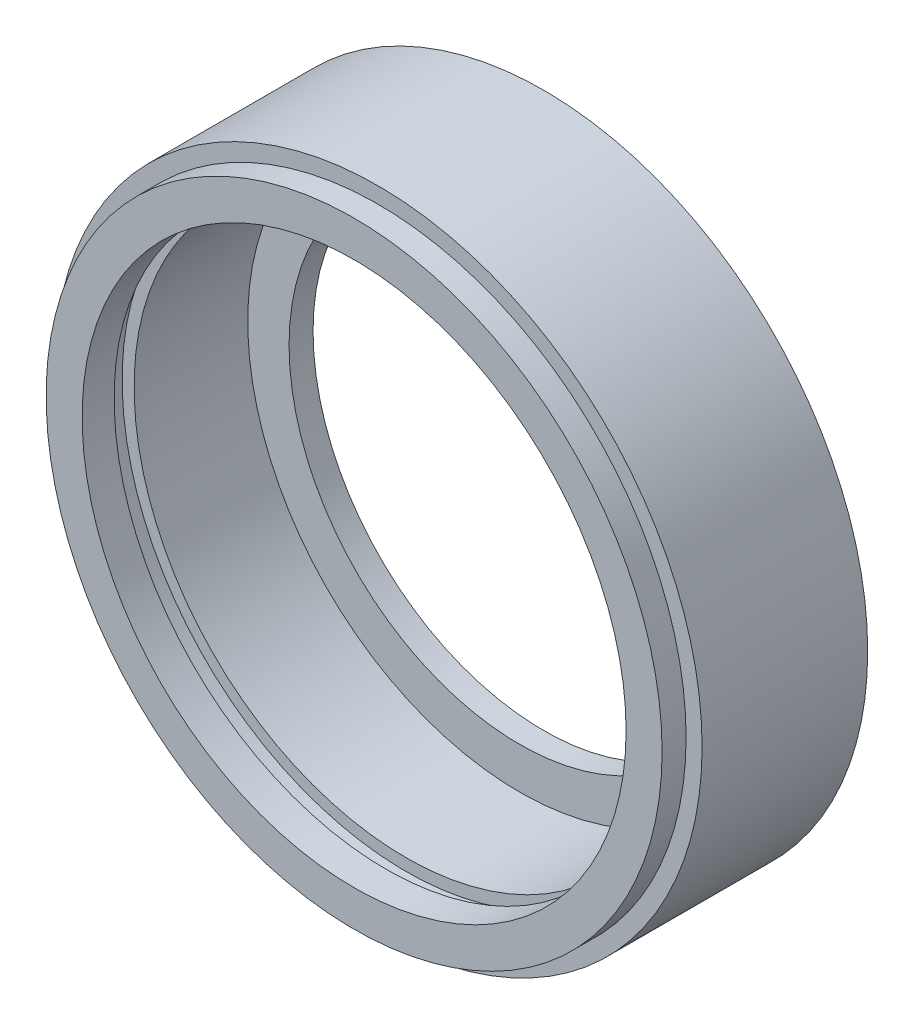
ISO-10303-21;
HEADER;
FILE_DESCRIPTION(('STEP AP214'),'2;1');
FILE_NAME('part.step','',(''),(''),'','','');
FILE_SCHEMA(('AUTOMOTIVE_DESIGN { 1 0 10303 214 1 1 1 1 }'));
ENDSEC;
DATA;
#1=APPLICATION_CONTEXT('core data for automotive mechanical design processes');
#2=APPLICATION_PROTOCOL_DEFINITION('international standard','automotive_design',2000,#1);
#3=PRODUCT_CONTEXT('',#1,'mechanical');
#4=PRODUCT('Part','Part','',(#3));
#5=PRODUCT_RELATED_PRODUCT_CATEGORY('part','',(#4));
#6=PRODUCT_DEFINITION_FORMATION('','',#4);
#7=PRODUCT_DEFINITION_CONTEXT('part definition',#1,'design');
#8=PRODUCT_DEFINITION('design','',#6,#7);
#9=PRODUCT_DEFINITION_SHAPE('','',#8);
#10=(LENGTH_UNIT() NAMED_UNIT(*) SI_UNIT(.MILLI.,.METRE.));
#11=(NAMED_UNIT(*) PLANE_ANGLE_UNIT() SI_UNIT($,.RADIAN.));
#12=(NAMED_UNIT(*) SI_UNIT($,.STERADIAN.) SOLID_ANGLE_UNIT());
#13=UNCERTAINTY_MEASURE_WITH_UNIT(LENGTH_MEASURE(1.E-05),#10,'distance_accuracy_value','');
#14=(GEOMETRIC_REPRESENTATION_CONTEXT(3) GLOBAL_UNCERTAINTY_ASSIGNED_CONTEXT((#13)) GLOBAL_UNIT_ASSIGNED_CONTEXT((#10,
#11,#12)) REPRESENTATION_CONTEXT('',''));
#15=CARTESIAN_POINT('',(0.,0.,0.));
#16=DIRECTION('',(0.,0.,1.));
#17=DIRECTION('',(1.,0.,0.));
#18=AXIS2_PLACEMENT_3D('',#15,#16,#17);
#19=CARTESIAN_POINT('',(0.,0.,1010.5));
#20=DIRECTION('',(0.,0.,1.));
#21=DIRECTION('',(1.,0.,0.));
#22=AXIS2_PLACEMENT_3D('',#19,#20,#21);
#23=CYLINDRICAL_SURFACE('',#22,40.5);
#24=CARTESIAN_POINT('',(0.,0.,20.6999999999999));
#25=DIRECTION('',(0.,0.,1.));
#26=DIRECTION('',(1.,0.,0.));
#27=AXIS2_PLACEMENT_3D('',#24,#25,#26);
#28=CIRCLE('',#27,40.5);
#29=CARTESIAN_POINT('',(40.5,0.,20.6999999999999));
#30=VERTEX_POINT('',#29);
#31=EDGE_CURVE('E10',#30,#30,#28,.T.);
#32=ORIENTED_EDGE('',*,*,#31,.F.);
#33=EDGE_LOOP('',(#32));
#34=FACE_BOUND('',#33,.T.);
#35=CARTESIAN_POINT('',(0.,0.,0.));
#36=DIRECTION('',(0.,0.,1.));
#37=DIRECTION('',(1.,0.,0.));
#38=AXIS2_PLACEMENT_3D('',#35,#36,#37);
#39=CIRCLE('',#38,40.5);
#40=CARTESIAN_POINT('',(40.5,0.,0.));
#41=VERTEX_POINT('',#40);
#42=EDGE_CURVE('E73',#41,#41,#39,.T.);
#43=ORIENTED_EDGE('',*,*,#42,.T.);
#44=EDGE_LOOP('',(#43));
#45=FACE_BOUND('',#44,.T.);
#46=ADVANCED_FACE('F33',(#34,#45),#23,.T.);
#47=CARTESIAN_POINT('',(0.,38.5,20.6999999999999));
#48=DIRECTION('',(0.,0.,-1.));
#49=DIRECTION('',(-1.,0.,0.));
#50=AXIS2_PLACEMENT_3D('',#47,#48,#49);
#51=PLANE('',#50);
#52=CARTESIAN_POINT('',(0.,0.,20.6999999999999));
#53=DIRECTION('',(0.,0.,1.));
#54=DIRECTION('',(1.,0.,0.));
#55=AXIS2_PLACEMENT_3D('',#52,#53,#54);
#56=CIRCLE('',#55,38.5);
#57=CARTESIAN_POINT('',(38.5,0.,20.6999999999999));
#58=VERTEX_POINT('',#57);
#59=EDGE_CURVE('E39',#58,#58,#56,.T.);
#60=ORIENTED_EDGE('',*,*,#59,.F.);
#61=EDGE_LOOP('',(#60));
#62=FACE_BOUND('',#61,.T.);
#63=ORIENTED_EDGE('',*,*,#31,.T.);
#64=EDGE_LOOP('',(#63));
#65=FACE_BOUND('',#64,.T.);
#66=ADVANCED_FACE('F134',(#62,#65),#51,.F.);
#67=CARTESIAN_POINT('',(0.,0.,1010.5));
#68=DIRECTION('',(0.,0.,1.));
#69=DIRECTION('',(1.,0.,0.));
#70=AXIS2_PLACEMENT_3D('',#67,#68,#69);
#71=CYLINDRICAL_SURFACE('',#70,38.5);
#72=CARTESIAN_POINT('',(0.,0.,23.6999999999999));
#73=DIRECTION('',(0.,0.,1.));
#74=DIRECTION('',(1.,0.,0.));
#75=AXIS2_PLACEMENT_3D('',#72,#73,#74);
#76=CIRCLE('',#75,38.5);
#77=CARTESIAN_POINT('',(38.5,0.,23.6999999999999));
#78=VERTEX_POINT('',#77);
#79=EDGE_CURVE('E43',#78,#78,#76,.T.);
#80=ORIENTED_EDGE('',*,*,#79,.F.);
#81=EDGE_LOOP('',(#80));
#82=FACE_BOUND('',#81,.T.);
#83=ORIENTED_EDGE('',*,*,#59,.T.);
#84=EDGE_LOOP('',(#83));
#85=FACE_BOUND('',#84,.T.);
#86=ADVANCED_FACE('F129',(#82,#85),#71,.T.);
#87=CARTESIAN_POINT('',(0.,34.,23.6999999999999));
#88=DIRECTION('',(0.,0.,-1.));
#89=DIRECTION('',(-1.,0.,0.));
#90=AXIS2_PLACEMENT_3D('',#87,#88,#89);
#91=PLANE('',#90);
#92=CARTESIAN_POINT('',(0.,0.,23.6999999999999));
#93=DIRECTION('',(0.,0.,1.));
#94=DIRECTION('',(1.,0.,0.));
#95=AXIS2_PLACEMENT_3D('',#92,#93,#94);
#96=CIRCLE('',#95,34.);
#97=CARTESIAN_POINT('',(34.,0.,23.6999999999999));
#98=VERTEX_POINT('',#97);
#99=EDGE_CURVE('E47',#98,#98,#96,.T.);
#100=ORIENTED_EDGE('',*,*,#99,.F.);
#101=EDGE_LOOP('',(#100));
#102=FACE_BOUND('',#101,.T.);
#103=ORIENTED_EDGE('',*,*,#79,.T.);
#104=EDGE_LOOP('',(#103));
#105=FACE_BOUND('',#104,.T.);
#106=ADVANCED_FACE('F123',(#102,#105),#91,.F.);
#107=CARTESIAN_POINT('',(0.,0.,1010.5));
#108=DIRECTION('',(0.,0.,1.));
#109=DIRECTION('',(1.,0.,0.));
#110=AXIS2_PLACEMENT_3D('',#107,#108,#109);
#111=CYLINDRICAL_SURFACE('',#110,34.);
#112=CARTESIAN_POINT('',(0.,0.,19.6999999999999));
#113=DIRECTION('',(0.,0.,1.));
#114=DIRECTION('',(1.,0.,0.));
#115=AXIS2_PLACEMENT_3D('',#112,#113,#114);
#116=CIRCLE('',#115,34.);
#117=CARTESIAN_POINT('',(34.,0.,19.6999999999999));
#118=VERTEX_POINT('',#117);
#119=EDGE_CURVE('E52',#118,#118,#116,.T.);
#120=ORIENTED_EDGE('',*,*,#119,.F.);
#121=EDGE_LOOP('',(#120));
#122=FACE_BOUND('',#121,.T.);
#123=ORIENTED_EDGE('',*,*,#99,.T.);
#124=EDGE_LOOP('',(#123));
#125=FACE_BOUND('',#124,.T.);
#126=ADVANCED_FACE('F117',(#122,#125),#111,.F.);
#127=CARTESIAN_POINT('',(0.,35.5,19.6999999999999));
#128=DIRECTION('',(0.,0.,1.));
#129=DIRECTION('',(1.,0.,0.));
#130=AXIS2_PLACEMENT_3D('',#127,#128,#129);
#131=PLANE('',#130);
#132=CARTESIAN_POINT('',(0.,0.,19.6999999999999));
#133=DIRECTION('',(0.,0.,1.));
#134=DIRECTION('',(1.,0.,0.));
#135=AXIS2_PLACEMENT_3D('',#132,#133,#134);
#136=CIRCLE('',#135,35.5);
#137=CARTESIAN_POINT('',(35.5,0.,19.6999999999999));
#138=VERTEX_POINT('',#137);
#139=EDGE_CURVE('E55',#138,#138,#136,.T.);
#140=ORIENTED_EDGE('',*,*,#139,.F.);
#141=EDGE_LOOP('',(#140));
#142=FACE_BOUND('',#141,.T.);
#143=ORIENTED_EDGE('',*,*,#119,.T.);
#144=EDGE_LOOP('',(#143));
#145=FACE_BOUND('',#144,.T.);
#146=ADVANCED_FACE('F111',(#142,#145),#131,.F.);
#147=CARTESIAN_POINT('',(0.,0.,1010.5));
#148=DIRECTION('',(0.,0.,1.));
#149=DIRECTION('',(1.,0.,0.));
#150=AXIS2_PLACEMENT_3D('',#147,#148,#149);
#151=CYLINDRICAL_SURFACE('',#150,35.5);
#152=CARTESIAN_POINT('',(0.,0.,17.2));
#153=DIRECTION('',(0.,0.,1.));
#154=DIRECTION('',(1.,0.,0.));
#155=AXIS2_PLACEMENT_3D('',#152,#153,#154);
#156=CIRCLE('',#155,35.5);
#157=CARTESIAN_POINT('',(35.5,0.,17.2));
#158=VERTEX_POINT('',#157);
#159=EDGE_CURVE('E58',#158,#158,#156,.T.);
#160=ORIENTED_EDGE('',*,*,#159,.F.);
#161=EDGE_LOOP('',(#160));
#162=FACE_BOUND('',#161,.T.);
#163=ORIENTED_EDGE('',*,*,#139,.T.);
#164=EDGE_LOOP('',(#163));
#165=FACE_BOUND('',#164,.T.);
#166=ADVANCED_FACE('F105',(#162,#165),#151,.F.);
#167=CARTESIAN_POINT('',(0.,35.5,17.1999999999999));
#168=DIRECTION('',(0.,0.,-1.));
#169=DIRECTION('',(-1.,0.,0.));
#170=AXIS2_PLACEMENT_3D('',#167,#168,#169);
#171=PLANE('',#170);
#172=CARTESIAN_POINT('',(0.,0.,17.2));
#173=DIRECTION('',(0.,0.,1.));
#174=DIRECTION('',(1.,0.,0.));
#175=AXIS2_PLACEMENT_3D('',#172,#173,#174);
#176=CIRCLE('',#175,34.);
#177=CARTESIAN_POINT('',(34.,0.,17.2));
#178=VERTEX_POINT('',#177);
#179=EDGE_CURVE('E61',#178,#178,#176,.T.);
#180=ORIENTED_EDGE('',*,*,#179,.F.);
#181=EDGE_LOOP('',(#180));
#182=FACE_BOUND('',#181,.T.);
#183=ORIENTED_EDGE('',*,*,#159,.T.);
#184=EDGE_LOOP('',(#183));
#185=FACE_BOUND('',#184,.T.);
#186=ADVANCED_FACE('F99',(#182,#185),#171,.F.);
#187=CARTESIAN_POINT('',(0.,0.,1010.5));
#188=DIRECTION('',(0.,0.,1.));
#189=DIRECTION('',(1.,0.,0.));
#190=AXIS2_PLACEMENT_3D('',#187,#188,#189);
#191=CYLINDRICAL_SURFACE('',#190,34.);
#192=CARTESIAN_POINT('',(0.,0.,2.99999999999989));
#193=DIRECTION('',(0.,0.,1.));
#194=DIRECTION('',(1.,0.,0.));
#195=AXIS2_PLACEMENT_3D('',#192,#193,#194);
#196=CIRCLE('',#195,34.);
#197=CARTESIAN_POINT('',(34.,0.,2.99999999999989));
#198=VERTEX_POINT('',#197);
#199=EDGE_CURVE('E64',#198,#198,#196,.T.);
#200=ORIENTED_EDGE('',*,*,#199,.F.);
#201=EDGE_LOOP('',(#200));
#202=FACE_BOUND('',#201,.T.);
#203=ORIENTED_EDGE('',*,*,#179,.T.);
#204=EDGE_LOOP('',(#203));
#205=FACE_BOUND('',#204,.T.);
#206=ADVANCED_FACE('F93',(#202,#205),#191,.F.);
#207=CARTESIAN_POINT('',(0.,34.,2.99999999999993));
#208=DIRECTION('',(0.,0.,-1.));
#209=DIRECTION('',(-1.,0.,0.));
#210=AXIS2_PLACEMENT_3D('',#207,#208,#209);
#211=PLANE('',#210);
#212=CARTESIAN_POINT('',(0.,0.,2.99999999999989));
#213=DIRECTION('',(0.,0.,1.));
#214=DIRECTION('',(1.,0.,0.));
#215=AXIS2_PLACEMENT_3D('',#212,#213,#214);
#216=CIRCLE('',#215,28.8333333333333);
#217=CARTESIAN_POINT('',(28.8333333333333,0.,2.99999999999989));
#218=VERTEX_POINT('',#217);
#219=EDGE_CURVE('E67',#218,#218,#216,.T.);
#220=ORIENTED_EDGE('',*,*,#219,.F.);
#221=EDGE_LOOP('',(#220));
#222=FACE_BOUND('',#221,.T.);
#223=ORIENTED_EDGE('',*,*,#199,.T.);
#224=EDGE_LOOP('',(#223));
#225=FACE_BOUND('',#224,.T.);
#226=ADVANCED_FACE('F87',(#222,#225),#211,.F.);
#227=CARTESIAN_POINT('',(0.,0.,1010.5));
#228=DIRECTION('',(0.,0.,1.));
#229=DIRECTION('',(1.,0.,0.));
#230=AXIS2_PLACEMENT_3D('',#227,#228,#229);
#231=CYLINDRICAL_SURFACE('',#230,28.8333333333333);
#232=CARTESIAN_POINT('',(0.,0.,0.));
#233=DIRECTION('',(0.,0.,1.));
#234=DIRECTION('',(1.,0.,0.));
#235=AXIS2_PLACEMENT_3D('',#232,#233,#234);
#236=CIRCLE('',#235,28.8333333333333);
#237=CARTESIAN_POINT('',(28.8333333333333,0.,0.));
#238=VERTEX_POINT('',#237);
#239=EDGE_CURVE('E70',#238,#238,#236,.T.);
#240=ORIENTED_EDGE('',*,*,#239,.F.);
#241=EDGE_LOOP('',(#240));
#242=FACE_BOUND('',#241,.T.);
#243=ORIENTED_EDGE('',*,*,#219,.T.);
#244=EDGE_LOOP('',(#243));
#245=FACE_BOUND('',#244,.T.);
#246=ADVANCED_FACE('F81',(#242,#245),#231,.F.);
#247=CARTESIAN_POINT('',(0.,28.8333333333333,0.));
#248=DIRECTION('',(0.,0.,1.));
#249=DIRECTION('',(1.,0.,0.));
#250=AXIS2_PLACEMENT_3D('',#247,#248,#249);
#251=PLANE('',#250);
#252=ORIENTED_EDGE('',*,*,#42,.F.);
#253=EDGE_LOOP('',(#252));
#254=FACE_BOUND('',#253,.T.);
#255=ORIENTED_EDGE('',*,*,#239,.T.);
#256=EDGE_LOOP('',(#255));
#257=FACE_BOUND('',#256,.T.);
#258=ADVANCED_FACE('F78',(#254,#257),#251,.F.);
#259=CLOSED_SHELL('',(#46,#66,#86,#106,#126,#146,#166,#186,#206,#226,#246,#258));
#260=MANIFOLD_SOLID_BREP('B2',#259);
#261=ADVANCED_BREP_SHAPE_REPRESENTATION('',(#18,#260),#14);
#262=SHAPE_DEFINITION_REPRESENTATION(#9,#261);
ENDSEC;
END-ISO-10303-21;
